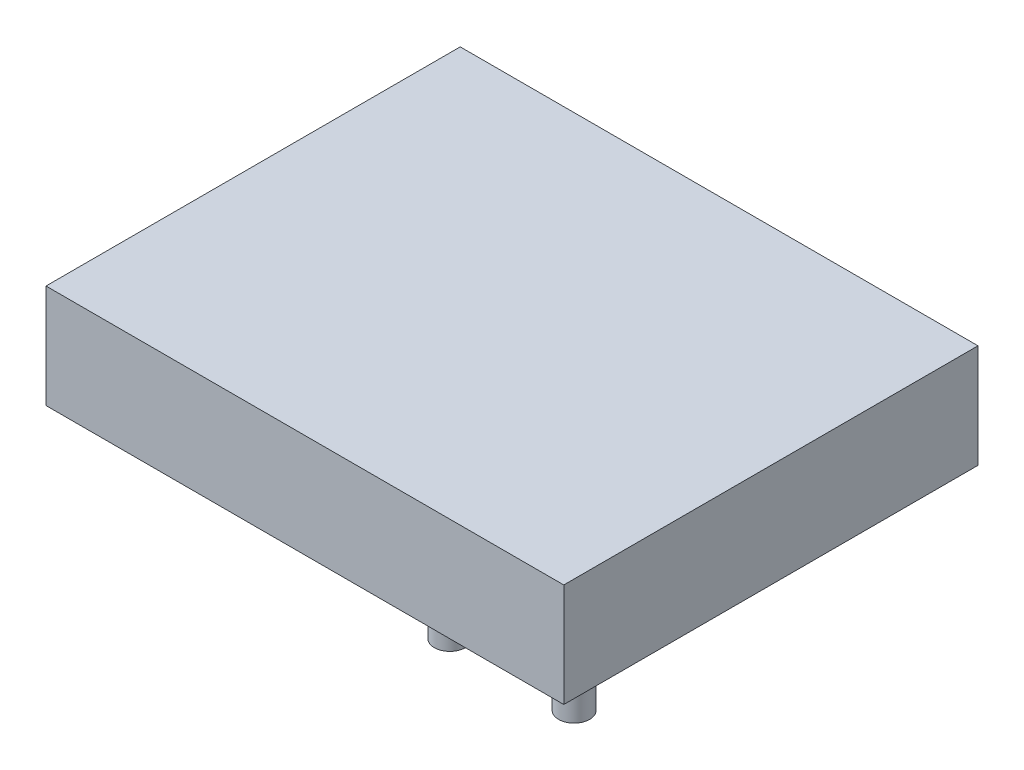
ISO-10303-21;
HEADER;
FILE_DESCRIPTION(('STEP AP214'),'2;1');
FILE_NAME('part.step','',(''),(''),'','','');
FILE_SCHEMA(('AUTOMOTIVE_DESIGN { 1 0 10303 214 1 1 1 1 }'));
ENDSEC;
DATA;
#1=APPLICATION_CONTEXT('core data for automotive mechanical design processes');
#2=APPLICATION_PROTOCOL_DEFINITION('international standard','automotive_design',2000,#1);
#3=PRODUCT_CONTEXT('',#1,'mechanical');
#4=PRODUCT('Part','Part','',(#3));
#5=PRODUCT_RELATED_PRODUCT_CATEGORY('part','',(#4));
#6=PRODUCT_DEFINITION_FORMATION('','',#4);
#7=PRODUCT_DEFINITION_CONTEXT('part definition',#1,'design');
#8=PRODUCT_DEFINITION('design','',#6,#7);
#9=PRODUCT_DEFINITION_SHAPE('','',#8);
#10=(LENGTH_UNIT() NAMED_UNIT(*) SI_UNIT(.MILLI.,.METRE.));
#11=(NAMED_UNIT(*) PLANE_ANGLE_UNIT() SI_UNIT($,.RADIAN.));
#12=(NAMED_UNIT(*) SI_UNIT($,.STERADIAN.) SOLID_ANGLE_UNIT());
#13=UNCERTAINTY_MEASURE_WITH_UNIT(LENGTH_MEASURE(1.E-05),#10,'distance_accuracy_value','');
#14=(GEOMETRIC_REPRESENTATION_CONTEXT(3) GLOBAL_UNCERTAINTY_ASSIGNED_CONTEXT((#13)) GLOBAL_UNIT_ASSIGNED_CONTEXT((#10,
#11,#12)) REPRESENTATION_CONTEXT('',''));
#15=CARTESIAN_POINT('',(0.,0.,0.));
#16=DIRECTION('',(0.,0.,1.));
#17=DIRECTION('',(1.,0.,0.));
#18=AXIS2_PLACEMENT_3D('',#15,#16,#17);
#19=CARTESIAN_POINT('',(25.,-5.,40.));
#20=DIRECTION('',(-1.,0.,0.));
#21=DIRECTION('',(0.,0.,1.));
#22=AXIS2_PLACEMENT_3D('',#19,#20,#21);
#23=PLANE('',#22);
#24=DIRECTION('',(0.,1.,0.));
#25=VECTOR('',#24,1.);
#26=CARTESIAN_POINT('',(25.,-5.,0.));
#27=LINE('',#26,#25);
#28=CARTESIAN_POINT('',(25.,-5.,0.));
#29=VERTEX_POINT('',#28);
#30=CARTESIAN_POINT('',(25.,5.,0.));
#31=VERTEX_POINT('',#30);
#32=EDGE_CURVE('E100',#29,#31,#27,.T.);
#33=ORIENTED_EDGE('',*,*,#32,.T.);
#34=DIRECTION('',(0.,0.,-1.));
#35=VECTOR('',#34,1.);
#36=CARTESIAN_POINT('',(25.,5.,40.));
#37=LINE('',#36,#35);
#38=CARTESIAN_POINT('',(25.,5.,40.));
#39=VERTEX_POINT('',#38);
#40=EDGE_CURVE('E91',#39,#31,#37,.T.);
#41=ORIENTED_EDGE('',*,*,#40,.F.);
#42=DIRECTION('',(0.,1.,0.));
#43=VECTOR('',#42,1.);
#44=CARTESIAN_POINT('',(25.,-5.,40.));
#45=LINE('',#44,#43);
#46=CARTESIAN_POINT('',(25.,-5.,40.));
#47=VERTEX_POINT('',#46);
#48=EDGE_CURVE('E85',#47,#39,#45,.T.);
#49=ORIENTED_EDGE('',*,*,#48,.F.);
#50=DIRECTION('',(0.,0.,-1.));
#51=VECTOR('',#50,1.);
#52=CARTESIAN_POINT('',(25.,-5.,40.));
#53=LINE('',#52,#51);
#54=EDGE_CURVE('E96',#47,#29,#53,.T.);
#55=ORIENTED_EDGE('',*,*,#54,.T.);
#56=EDGE_LOOP('',(#33,#41,#49,#55));
#57=FACE_BOUND('',#56,.T.);
#58=ADVANCED_FACE('F33',(#57),#23,.F.);
#59=CARTESIAN_POINT('',(-25.,5.,40.));
#60=DIRECTION('',(0.,-1.,0.));
#61=DIRECTION('',(0.,0.,-1.));
#62=AXIS2_PLACEMENT_3D('',#59,#60,#61);
#63=PLANE('',#62);
#64=DIRECTION('',(-1.,0.,0.));
#65=VECTOR('',#64,1.);
#66=CARTESIAN_POINT('',(-25.,5.,0.));
#67=LINE('',#66,#65);
#68=CARTESIAN_POINT('',(-25.,5.,0.));
#69=VERTEX_POINT('',#68);
#70=EDGE_CURVE('E90',#31,#69,#67,.T.);
#71=ORIENTED_EDGE('',*,*,#70,.T.);
#72=DIRECTION('',(0.,0.,-1.));
#73=VECTOR('',#72,1.);
#74=CARTESIAN_POINT('',(-25.,5.,40.));
#75=LINE('',#74,#73);
#76=CARTESIAN_POINT('',(-25.,5.,40.));
#77=VERTEX_POINT('',#76);
#78=EDGE_CURVE('E88',#77,#69,#75,.T.);
#79=ORIENTED_EDGE('',*,*,#78,.F.);
#80=DIRECTION('',(-1.,0.,0.));
#81=VECTOR('',#80,1.);
#82=CARTESIAN_POINT('',(-25.,5.,40.));
#83=LINE('',#82,#81);
#84=EDGE_CURVE('E80',#39,#77,#83,.T.);
#85=ORIENTED_EDGE('',*,*,#84,.F.);
#86=ORIENTED_EDGE('',*,*,#40,.T.);
#87=EDGE_LOOP('',(#71,#79,#85,#86));
#88=FACE_BOUND('',#87,.T.);
#89=ADVANCED_FACE('F89',(#88),#63,.F.);
#90=CARTESIAN_POINT('',(-25.,-5.,40.));
#91=DIRECTION('',(1.,0.,0.));
#92=DIRECTION('',(0.,0.,-1.));
#93=AXIS2_PLACEMENT_3D('',#90,#91,#92);
#94=PLANE('',#93);
#95=DIRECTION('',(0.,-1.,0.));
#96=VECTOR('',#95,1.);
#97=CARTESIAN_POINT('',(-25.,-5.,0.));
#98=LINE('',#97,#96);
#99=CARTESIAN_POINT('',(-25.,-5.,0.));
#100=VERTEX_POINT('',#99);
#101=EDGE_CURVE('E66',#69,#100,#98,.T.);
#102=ORIENTED_EDGE('',*,*,#101,.T.);
#103=DIRECTION('',(0.,0.,-1.));
#104=VECTOR('',#103,1.);
#105=CARTESIAN_POINT('',(-25.,-5.,40.));
#106=LINE('',#105,#104);
#107=CARTESIAN_POINT('',(-25.,-5.,40.));
#108=VERTEX_POINT('',#107);
#109=EDGE_CURVE('E92',#108,#100,#106,.T.);
#110=ORIENTED_EDGE('',*,*,#109,.F.);
#111=DIRECTION('',(0.,-1.,0.));
#112=VECTOR('',#111,1.);
#113=CARTESIAN_POINT('',(-25.,-5.,40.));
#114=LINE('',#113,#112);
#115=EDGE_CURVE('E83',#77,#108,#114,.T.);
#116=ORIENTED_EDGE('',*,*,#115,.F.);
#117=ORIENTED_EDGE('',*,*,#78,.T.);
#118=EDGE_LOOP('',(#102,#110,#116,#117));
#119=FACE_BOUND('',#118,.T.);
#120=ADVANCED_FACE('F94',(#119),#94,.F.);
#121=CARTESIAN_POINT('',(-25.,-5.,40.));
#122=DIRECTION('',(0.,1.,0.));
#123=DIRECTION('',(0.,0.,1.));
#124=AXIS2_PLACEMENT_3D('',#121,#122,#123);
#125=PLANE('',#124);
#126=CARTESIAN_POINT('',(6.,-5.,20.));
#127=DIRECTION('',(0.,1.,0.));
#128=DIRECTION('',(0.,0.,1.));
#129=AXIS2_PLACEMENT_3D('',#126,#127,#128);
#130=CIRCLE('',#129,1.5);
#131=CARTESIAN_POINT('',(6.,-5.,21.5));
#132=VERTEX_POINT('',#131);
#133=EDGE_CURVE('E11',#132,#132,#130,.F.);
#134=ORIENTED_EDGE('',*,*,#133,.F.);
#135=EDGE_LOOP('',(#134));
#136=FACE_BOUND('',#135,.T.);
#137=CARTESIAN_POINT('',(-6.,-5.,20.));
#138=DIRECTION('',(0.,1.,0.));
#139=DIRECTION('',(0.,0.,1.));
#140=AXIS2_PLACEMENT_3D('',#137,#138,#139);
#141=CIRCLE('',#140,1.5);
#142=CARTESIAN_POINT('',(-6.,-5.,21.5));
#143=VERTEX_POINT('',#142);
#144=EDGE_CURVE('E41',#143,#143,#141,.F.);
#145=ORIENTED_EDGE('',*,*,#144,.F.);
#146=EDGE_LOOP('',(#145));
#147=FACE_BOUND('',#146,.T.);
#148=DIRECTION('',(1.,0.,0.));
#149=VECTOR('',#148,1.);
#150=CARTESIAN_POINT('',(-25.,-5.,0.));
#151=LINE('',#150,#149);
#152=EDGE_CURVE('E72',#100,#29,#151,.T.);
#153=ORIENTED_EDGE('',*,*,#152,.T.);
#154=ORIENTED_EDGE('',*,*,#54,.F.);
#155=DIRECTION('',(1.,0.,0.));
#156=VECTOR('',#155,1.);
#157=CARTESIAN_POINT('',(-25.,-5.,40.));
#158=LINE('',#157,#156);
#159=EDGE_CURVE('E49',#108,#47,#158,.T.);
#160=ORIENTED_EDGE('',*,*,#159,.F.);
#161=ORIENTED_EDGE('',*,*,#109,.T.);
#162=EDGE_LOOP('',(#153,#154,#160,#161));
#163=FACE_BOUND('',#162,.T.);
#164=ADVANCED_FACE('F114',(#136,#147,#163),#125,.F.);
#165=CARTESIAN_POINT('',(0.,0.,40.));
#166=DIRECTION('',(0.,0.,-1.));
#167=DIRECTION('',(-1.,0.,0.));
#168=AXIS2_PLACEMENT_3D('',#165,#166,#167);
#169=PLANE('',#168);
#170=ORIENTED_EDGE('',*,*,#48,.T.);
#171=ORIENTED_EDGE('',*,*,#84,.T.);
#172=ORIENTED_EDGE('',*,*,#115,.T.);
#173=ORIENTED_EDGE('',*,*,#159,.T.);
#174=EDGE_LOOP('',(#170,#171,#172,#173));
#175=FACE_BOUND('',#174,.T.);
#176=ADVANCED_FACE('F81',(#175),#169,.F.);
#177=CARTESIAN_POINT('',(0.,0.,0.));
#178=DIRECTION('',(0.,0.,-1.));
#179=DIRECTION('',(-1.,0.,0.));
#180=AXIS2_PLACEMENT_3D('',#177,#178,#179);
#181=PLANE('',#180);
#182=ORIENTED_EDGE('',*,*,#32,.F.);
#183=ORIENTED_EDGE('',*,*,#152,.F.);
#184=ORIENTED_EDGE('',*,*,#101,.F.);
#185=ORIENTED_EDGE('',*,*,#70,.F.);
#186=EDGE_LOOP('',(#182,#183,#184,#185));
#187=FACE_BOUND('',#186,.T.);
#188=ADVANCED_FACE('F122',(#187),#181,.T.);
#189=CARTESIAN_POINT('',(-6.,-25.,20.));
#190=DIRECTION('',(0.,1.,0.));
#191=DIRECTION('',(0.,0.,1.));
#192=AXIS2_PLACEMENT_3D('',#189,#190,#191);
#193=CYLINDRICAL_SURFACE('',#192,1.5);
#194=CARTESIAN_POINT('',(-6.,-25.,20.));
#195=DIRECTION('',(0.,-1.,0.));
#196=DIRECTION('',(0.,0.,-1.));
#197=AXIS2_PLACEMENT_3D('',#194,#195,#196);
#198=CIRCLE('',#197,1.5);
#199=CARTESIAN_POINT('',(-6.,-25.,18.5));
#200=VERTEX_POINT('',#199);
#201=EDGE_CURVE('E103',#200,#200,#198,.T.);
#202=ORIENTED_EDGE('',*,*,#201,.F.);
#203=EDGE_LOOP('',(#202));
#204=FACE_BOUND('',#203,.T.);
#205=ORIENTED_EDGE('',*,*,#144,.T.);
#206=EDGE_LOOP('',(#205));
#207=FACE_BOUND('',#206,.T.);
#208=ADVANCED_FACE('F112',(#204,#207),#193,.T.);
#209=CARTESIAN_POINT('',(-6.,-25.,20.));
#210=DIRECTION('',(0.,-1.,0.));
#211=DIRECTION('',(0.,0.,-1.));
#212=AXIS2_PLACEMENT_3D('',#209,#210,#211);
#213=PLANE('',#212);
#214=ORIENTED_EDGE('',*,*,#201,.T.);
#215=EDGE_LOOP('',(#214));
#216=FACE_BOUND('',#215,.T.);
#217=ADVANCED_FACE('F138',(#216),#213,.T.);
#218=CARTESIAN_POINT('',(6.,-25.,20.));
#219=DIRECTION('',(0.,1.,0.));
#220=DIRECTION('',(0.,0.,1.));
#221=AXIS2_PLACEMENT_3D('',#218,#219,#220);
#222=CYLINDRICAL_SURFACE('',#221,1.5);
#223=CARTESIAN_POINT('',(6.,-25.,20.));
#224=DIRECTION('',(0.,-1.,0.));
#225=DIRECTION('',(0.,0.,-1.));
#226=AXIS2_PLACEMENT_3D('',#223,#224,#225);
#227=CIRCLE('',#226,1.5);
#228=CARTESIAN_POINT('',(6.,-25.,18.5));
#229=VERTEX_POINT('',#228);
#230=EDGE_CURVE('E156',#229,#229,#227,.T.);
#231=ORIENTED_EDGE('',*,*,#230,.F.);
#232=EDGE_LOOP('',(#231));
#233=FACE_BOUND('',#232,.T.);
#234=ORIENTED_EDGE('',*,*,#133,.T.);
#235=EDGE_LOOP('',(#234));
#236=FACE_BOUND('',#235,.T.);
#237=ADVANCED_FACE('F144',(#233,#236),#222,.T.);
#238=CARTESIAN_POINT('',(6.,-25.,20.));
#239=DIRECTION('',(0.,-1.,0.));
#240=DIRECTION('',(0.,0.,-1.));
#241=AXIS2_PLACEMENT_3D('',#238,#239,#240);
#242=PLANE('',#241);
#243=ORIENTED_EDGE('',*,*,#230,.T.);
#244=EDGE_LOOP('',(#243));
#245=FACE_BOUND('',#244,.T.);
#246=ADVANCED_FACE('F148',(#245),#242,.T.);
#247=CLOSED_SHELL('',(#58,#89,#120,#164,#176,#188,#208,#217,#237,#246));
#248=MANIFOLD_SOLID_BREP('B2',#247);
#249=ADVANCED_BREP_SHAPE_REPRESENTATION('',(#18,#248),#14);
#250=SHAPE_DEFINITION_REPRESENTATION(#9,#249);
ENDSEC;
END-ISO-10303-21;
